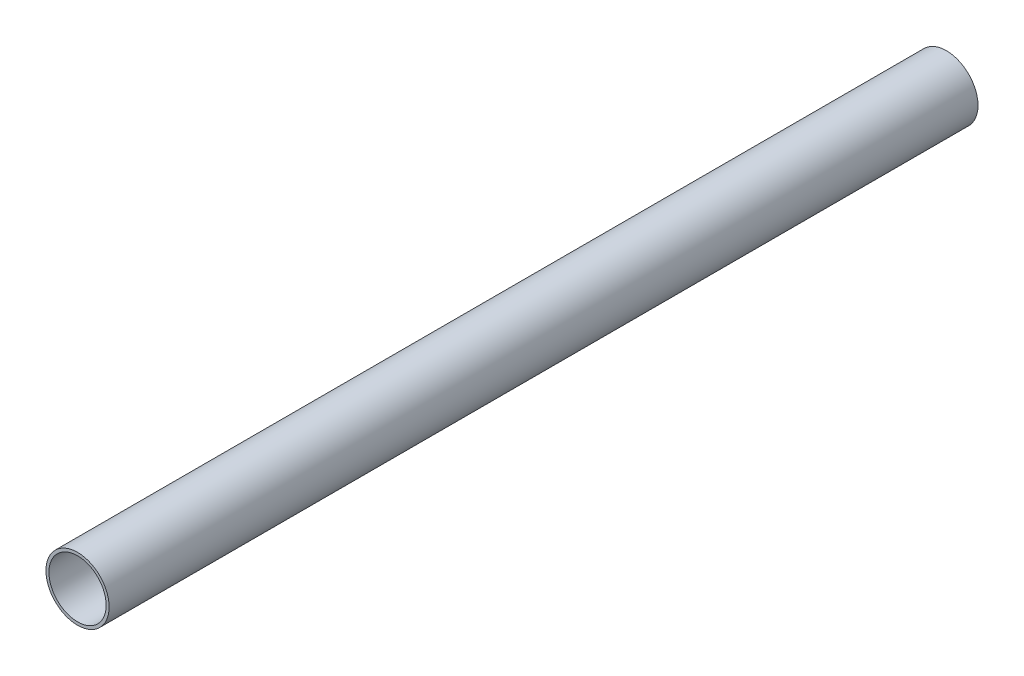
ISO-10303-21;
HEADER;
FILE_DESCRIPTION(('STEP AP214'),'2;1');
FILE_NAME('part.step','',(''),(''),'','','');
FILE_SCHEMA(('AUTOMOTIVE_DESIGN { 1 0 10303 214 1 1 1 1 }'));
ENDSEC;
DATA;
#1=APPLICATION_CONTEXT('core data for automotive mechanical design processes');
#2=APPLICATION_PROTOCOL_DEFINITION('international standard','automotive_design',2000,#1);
#3=PRODUCT_CONTEXT('',#1,'mechanical');
#4=PRODUCT('Part','Part','',(#3));
#5=PRODUCT_RELATED_PRODUCT_CATEGORY('part','',(#4));
#6=PRODUCT_DEFINITION_FORMATION('','',#4);
#7=PRODUCT_DEFINITION_CONTEXT('part definition',#1,'design');
#8=PRODUCT_DEFINITION('design','',#6,#7);
#9=PRODUCT_DEFINITION_SHAPE('','',#8);
#10=(LENGTH_UNIT() NAMED_UNIT(*) SI_UNIT(.MILLI.,.METRE.));
#11=(NAMED_UNIT(*) PLANE_ANGLE_UNIT() SI_UNIT($,.RADIAN.));
#12=(NAMED_UNIT(*) SI_UNIT($,.STERADIAN.) SOLID_ANGLE_UNIT());
#13=UNCERTAINTY_MEASURE_WITH_UNIT(LENGTH_MEASURE(1.E-05),#10,'distance_accuracy_value','');
#14=(GEOMETRIC_REPRESENTATION_CONTEXT(3) GLOBAL_UNCERTAINTY_ASSIGNED_CONTEXT((#13)) GLOBAL_UNIT_ASSIGNED_CONTEXT((#10,
#11,#12)) REPRESENTATION_CONTEXT('',''));
#15=CARTESIAN_POINT('',(0.,0.,0.));
#16=DIRECTION('',(0.,0.,1.));
#17=DIRECTION('',(1.,0.,0.));
#18=AXIS2_PLACEMENT_3D('',#15,#16,#17);
#19=CARTESIAN_POINT('',(0.,0.,-220.));
#20=DIRECTION('',(0.,0.,1.));
#21=DIRECTION('',(1.,0.,0.));
#22=AXIS2_PLACEMENT_3D('',#19,#20,#21);
#23=CYLINDRICAL_SURFACE('',#22,8.);
#24=CARTESIAN_POINT('',(0.,0.,-220.));
#25=DIRECTION('',(0.,0.,1.));
#26=DIRECTION('',(1.,0.,0.));
#27=AXIS2_PLACEMENT_3D('',#24,#25,#26);
#28=CIRCLE('',#27,8.);
#29=CARTESIAN_POINT('',(8.,0.,-220.));
#30=VERTEX_POINT('',#29);
#31=EDGE_CURVE('E10',#30,#30,#28,.T.);
#32=ORIENTED_EDGE('',*,*,#31,.T.);
#33=EDGE_LOOP('',(#32));
#34=FACE_BOUND('',#33,.T.);
#35=CARTESIAN_POINT('',(0.,0.,0.));
#36=DIRECTION('',(0.,0.,1.));
#37=DIRECTION('',(1.,0.,0.));
#38=AXIS2_PLACEMENT_3D('',#35,#36,#37);
#39=CIRCLE('',#38,8.);
#40=CARTESIAN_POINT('',(8.,0.,0.));
#41=VERTEX_POINT('',#40);
#42=EDGE_CURVE('E31',#41,#41,#39,.T.);
#43=ORIENTED_EDGE('',*,*,#42,.F.);
#44=EDGE_LOOP('',(#43));
#45=FACE_BOUND('',#44,.T.);
#46=ADVANCED_FACE('F28',(#34,#45),#23,.T.);
#47=CARTESIAN_POINT('',(0.,0.,-220.));
#48=DIRECTION('',(0.,0.,1.));
#49=DIRECTION('',(1.,0.,0.));
#50=AXIS2_PLACEMENT_3D('',#47,#48,#49);
#51=PLANE('',#50);
#52=CARTESIAN_POINT('',(0.,0.,-220.));
#53=DIRECTION('',(0.,0.,1.));
#54=DIRECTION('',(1.,0.,0.));
#55=AXIS2_PLACEMENT_3D('',#52,#53,#54);
#56=CIRCLE('',#55,7.25);
#57=CARTESIAN_POINT('',(7.25,0.,-220.));
#58=VERTEX_POINT('',#57);
#59=EDGE_CURVE('E38',#58,#58,#56,.T.);
#60=ORIENTED_EDGE('',*,*,#59,.T.);
#61=EDGE_LOOP('',(#60));
#62=FACE_BOUND('',#61,.T.);
#63=ORIENTED_EDGE('',*,*,#31,.F.);
#64=EDGE_LOOP('',(#63));
#65=FACE_BOUND('',#64,.T.);
#66=ADVANCED_FACE('F46',(#62,#65),#51,.F.);
#67=CARTESIAN_POINT('',(0.,0.,0.));
#68=DIRECTION('',(0.,0.,1.));
#69=DIRECTION('',(1.,0.,0.));
#70=AXIS2_PLACEMENT_3D('',#67,#68,#69);
#71=PLANE('',#70);
#72=CARTESIAN_POINT('',(0.,0.,0.));
#73=DIRECTION('',(0.,0.,1.));
#74=DIRECTION('',(1.,0.,0.));
#75=AXIS2_PLACEMENT_3D('',#72,#73,#74);
#76=CIRCLE('',#75,7.25);
#77=CARTESIAN_POINT('',(7.25,0.,0.));
#78=VERTEX_POINT('',#77);
#79=EDGE_CURVE('E40',#78,#78,#76,.T.);
#80=ORIENTED_EDGE('',*,*,#79,.F.);
#81=EDGE_LOOP('',(#80));
#82=FACE_BOUND('',#81,.T.);
#83=ORIENTED_EDGE('',*,*,#42,.T.);
#84=EDGE_LOOP('',(#83));
#85=FACE_BOUND('',#84,.T.);
#86=ADVANCED_FACE('F52',(#82,#85),#71,.T.);
#87=CARTESIAN_POINT('',(0.,0.,-220.));
#88=DIRECTION('',(0.,0.,1.));
#89=DIRECTION('',(1.,0.,0.));
#90=AXIS2_PLACEMENT_3D('',#87,#88,#89);
#91=CYLINDRICAL_SURFACE('',#90,7.25);
#92=ORIENTED_EDGE('',*,*,#59,.F.);
#93=EDGE_LOOP('',(#92));
#94=FACE_BOUND('',#93,.T.);
#95=ORIENTED_EDGE('',*,*,#79,.T.);
#96=EDGE_LOOP('',(#95));
#97=FACE_BOUND('',#96,.T.);
#98=ADVANCED_FACE('F49',(#94,#97),#91,.F.);
#99=CLOSED_SHELL('',(#46,#66,#86,#98));
#100=MANIFOLD_SOLID_BREP('B2',#99);
#101=ADVANCED_BREP_SHAPE_REPRESENTATION('',(#18,#100),#14);
#102=SHAPE_DEFINITION_REPRESENTATION(#9,#101);
ENDSEC;
END-ISO-10303-21;
